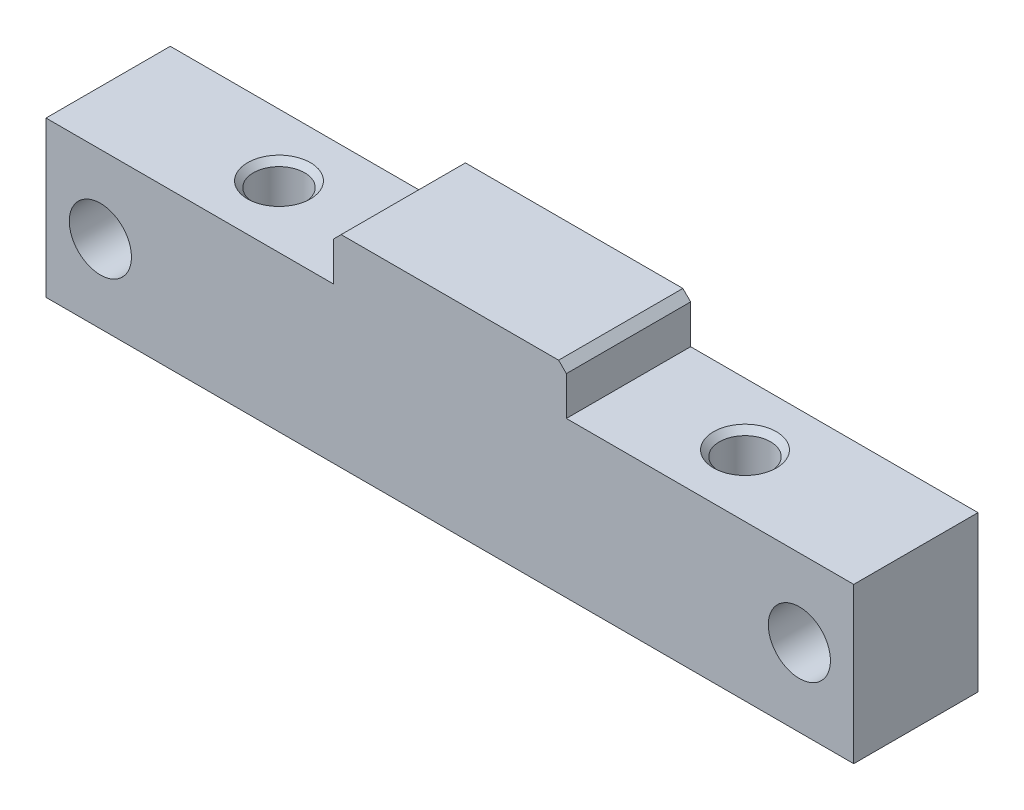
ISO-10303-21;
HEADER;
FILE_DESCRIPTION(('STEP AP214'),'2;1');
FILE_NAME('part.step','',(''),(''),'','','');
FILE_SCHEMA(('AUTOMOTIVE_DESIGN { 1 0 10303 214 1 1 1 1 }'));
ENDSEC;
DATA;
#1=APPLICATION_CONTEXT('core data for automotive mechanical design processes');
#2=APPLICATION_PROTOCOL_DEFINITION('international standard','automotive_design',2000,#1);
#3=PRODUCT_CONTEXT('',#1,'mechanical');
#4=PRODUCT('Part','Part','',(#3));
#5=PRODUCT_RELATED_PRODUCT_CATEGORY('part','',(#4));
#6=PRODUCT_DEFINITION_FORMATION('','',#4);
#7=PRODUCT_DEFINITION_CONTEXT('part definition',#1,'design');
#8=PRODUCT_DEFINITION('design','',#6,#7);
#9=PRODUCT_DEFINITION_SHAPE('','',#8);
#10=(LENGTH_UNIT() NAMED_UNIT(*) SI_UNIT(.MILLI.,.METRE.));
#11=(NAMED_UNIT(*) PLANE_ANGLE_UNIT() SI_UNIT($,.RADIAN.));
#12=(NAMED_UNIT(*) SI_UNIT($,.STERADIAN.) SOLID_ANGLE_UNIT());
#13=UNCERTAINTY_MEASURE_WITH_UNIT(LENGTH_MEASURE(1.E-05),#10,'distance_accuracy_value','');
#14=(GEOMETRIC_REPRESENTATION_CONTEXT(3) GLOBAL_UNCERTAINTY_ASSIGNED_CONTEXT((#13)) GLOBAL_UNIT_ASSIGNED_CONTEXT((#10,
#11,#12)) REPRESENTATION_CONTEXT('',''));
#15=CARTESIAN_POINT('',(0.,0.,0.));
#16=DIRECTION('',(0.,0.,1.));
#17=DIRECTION('',(1.,0.,0.));
#18=AXIS2_PLACEMENT_3D('',#15,#16,#17);
#19=CARTESIAN_POINT('',(7.5,13.,8.));
#20=DIRECTION('',(-1.,0.,0.));
#21=DIRECTION('',(0.,-1.,0.));
#22=AXIS2_PLACEMENT_3D('',#19,#20,#21);
#23=PLANE('',#22);
#24=DIRECTION('',(0.,1.,0.));
#25=VECTOR('',#24,1.);
#26=CARTESIAN_POINT('',(7.5,13.,0.));
#27=LINE('',#26,#25);
#28=CARTESIAN_POINT('',(7.5,10.,0.));
#29=VERTEX_POINT('',#28);
#30=CARTESIAN_POINT('',(7.5,12.5,0.));
#31=VERTEX_POINT('',#30);
#32=EDGE_CURVE('E161',#29,#31,#27,.T.);
#33=ORIENTED_EDGE('',*,*,#32,.T.);
#34=DIRECTION('',(0.,0.,1.));
#35=VECTOR('',#34,1.);
#36=CARTESIAN_POINT('',(7.5,12.5,8.));
#37=LINE('',#36,#35);
#38=CARTESIAN_POINT('',(7.5,12.5,8.));
#39=VERTEX_POINT('',#38);
#40=EDGE_CURVE('E72',#31,#39,#37,.T.);
#41=ORIENTED_EDGE('',*,*,#40,.T.);
#42=DIRECTION('',(0.,1.,0.));
#43=VECTOR('',#42,1.);
#44=CARTESIAN_POINT('',(7.5,13.,8.));
#45=LINE('',#44,#43);
#46=CARTESIAN_POINT('',(7.5,10.,8.));
#47=VERTEX_POINT('',#46);
#48=EDGE_CURVE('E178',#47,#39,#45,.T.);
#49=ORIENTED_EDGE('',*,*,#48,.F.);
#50=DIRECTION('',(0.,0.,-1.));
#51=VECTOR('',#50,1.);
#52=CARTESIAN_POINT('',(7.5,10.,8.));
#53=LINE('',#52,#51);
#54=EDGE_CURVE('E160',#47,#29,#53,.T.);
#55=ORIENTED_EDGE('',*,*,#54,.T.);
#56=EDGE_LOOP('',(#33,#41,#49,#55));
#57=FACE_BOUND('',#56,.T.);
#58=ADVANCED_FACE('F49',(#57),#23,.F.);
#59=CARTESIAN_POINT('',(-7.49999999999999,13.,8.));
#60=DIRECTION('',(0.,-1.,0.));
#61=DIRECTION('',(1.,0.,0.));
#62=AXIS2_PLACEMENT_3D('',#59,#60,#61);
#63=PLANE('',#62);
#64=DIRECTION('',(-1.,0.,0.));
#65=VECTOR('',#64,1.);
#66=CARTESIAN_POINT('',(-7.49999999999999,13.,8.));
#67=LINE('',#66,#65);
#68=CARTESIAN_POINT('',(7.,13.,8.));
#69=VERTEX_POINT('',#68);
#70=CARTESIAN_POINT('',(-6.99999999999999,13.,8.));
#71=VERTEX_POINT('',#70);
#72=EDGE_CURVE('E134',#69,#71,#67,.T.);
#73=ORIENTED_EDGE('',*,*,#72,.F.);
#74=DIRECTION('',(0.,0.,-1.));
#75=VECTOR('',#74,1.);
#76=CARTESIAN_POINT('',(7.,13.,8.));
#77=LINE('',#76,#75);
#78=CARTESIAN_POINT('',(7.,13.,0.));
#79=VERTEX_POINT('',#78);
#80=EDGE_CURVE('E192',#69,#79,#77,.T.);
#81=ORIENTED_EDGE('',*,*,#80,.T.);
#82=DIRECTION('',(-1.,0.,0.));
#83=VECTOR('',#82,1.);
#84=CARTESIAN_POINT('',(-7.49999999999999,13.,0.));
#85=LINE('',#84,#83);
#86=CARTESIAN_POINT('',(-6.99999999999999,13.,0.));
#87=VERTEX_POINT('',#86);
#88=EDGE_CURVE('E163',#79,#87,#85,.T.);
#89=ORIENTED_EDGE('',*,*,#88,.T.);
#90=DIRECTION('',(0.,0.,1.));
#91=VECTOR('',#90,1.);
#92=CARTESIAN_POINT('',(-6.99999999999999,13.,8.));
#93=LINE('',#92,#91);
#94=EDGE_CURVE('E143',#87,#71,#93,.T.);
#95=ORIENTED_EDGE('',*,*,#94,.T.);
#96=EDGE_LOOP('',(#73,#81,#89,#95));
#97=FACE_BOUND('',#96,.T.);
#98=ADVANCED_FACE('F205',(#97),#63,.F.);
#99=CARTESIAN_POINT('',(-7.49999999999999,13.,8.));
#100=DIRECTION('',(1.,0.,0.));
#101=DIRECTION('',(0.,1.,0.));
#102=AXIS2_PLACEMENT_3D('',#99,#100,#101);
#103=PLANE('',#102);
#104=DIRECTION('',(0.,-1.,0.));
#105=VECTOR('',#104,1.);
#106=CARTESIAN_POINT('',(-7.49999999999999,13.,8.));
#107=LINE('',#106,#105);
#108=CARTESIAN_POINT('',(-7.49999999999999,12.5,8.));
#109=VERTEX_POINT('',#108);
#110=CARTESIAN_POINT('',(-7.49999999999999,10.,8.));
#111=VERTEX_POINT('',#110);
#112=EDGE_CURVE('E126',#109,#111,#107,.T.);
#113=ORIENTED_EDGE('',*,*,#112,.F.);
#114=DIRECTION('',(0.,0.,-1.));
#115=VECTOR('',#114,1.);
#116=CARTESIAN_POINT('',(-7.49999999999999,12.5,8.));
#117=LINE('',#116,#115);
#118=CARTESIAN_POINT('',(-7.49999999999999,12.5,0.));
#119=VERTEX_POINT('',#118);
#120=EDGE_CURVE('E13',#109,#119,#117,.T.);
#121=ORIENTED_EDGE('',*,*,#120,.T.);
#122=DIRECTION('',(0.,-1.,0.));
#123=VECTOR('',#122,1.);
#124=CARTESIAN_POINT('',(-7.49999999999999,13.,0.));
#125=LINE('',#124,#123);
#126=CARTESIAN_POINT('',(-7.49999999999999,10.,0.));
#127=VERTEX_POINT('',#126);
#128=EDGE_CURVE('E140',#119,#127,#125,.T.);
#129=ORIENTED_EDGE('',*,*,#128,.T.);
#130=DIRECTION('',(0.,0.,-1.));
#131=VECTOR('',#130,1.);
#132=CARTESIAN_POINT('',(-7.49999999999999,10.,8.));
#133=LINE('',#132,#131);
#134=EDGE_CURVE('E137',#111,#127,#133,.T.);
#135=ORIENTED_EDGE('',*,*,#134,.F.);
#136=EDGE_LOOP('',(#113,#121,#129,#135));
#137=FACE_BOUND('',#136,.T.);
#138=ADVANCED_FACE('F138',(#137),#103,.F.);
#139=CARTESIAN_POINT('',(-7.49999999999999,10.,8.));
#140=DIRECTION('',(0.,-1.,0.));
#141=DIRECTION('',(1.,0.,0.));
#142=AXIS2_PLACEMENT_3D('',#139,#140,#141);
#143=PLANE('',#142);
#144=CARTESIAN_POINT('',(-15.,10.,4.));
#145=DIRECTION('',(0.,1.,0.));
#146=DIRECTION('',(0.,0.,1.));
#147=AXIS2_PLACEMENT_3D('',#144,#145,#146);
#148=CIRCLE('',#147,2.025);
#149=CARTESIAN_POINT('',(-15.,10.,6.025));
#150=VERTEX_POINT('',#149);
#151=EDGE_CURVE('E295',#150,#150,#148,.T.);
#152=ORIENTED_EDGE('',*,*,#151,.F.);
#153=EDGE_LOOP('',(#152));
#154=FACE_BOUND('',#153,.T.);
#155=DIRECTION('',(-1.,0.,0.));
#156=VECTOR('',#155,1.);
#157=CARTESIAN_POINT('',(-7.49999999999999,10.,0.));
#158=LINE('',#157,#156);
#159=CARTESIAN_POINT('',(-26.,9.99999999999999,0.));
#160=VERTEX_POINT('',#159);
#161=EDGE_CURVE('E168',#127,#160,#158,.T.);
#162=ORIENTED_EDGE('',*,*,#161,.T.);
#163=DIRECTION('',(0.,0.,-1.));
#164=VECTOR('',#163,1.);
#165=CARTESIAN_POINT('',(-26.,9.99999999999999,8.));
#166=LINE('',#165,#164);
#167=CARTESIAN_POINT('',(-26.,9.99999999999999,8.));
#168=VERTEX_POINT('',#167);
#169=EDGE_CURVE('E144',#168,#160,#166,.T.);
#170=ORIENTED_EDGE('',*,*,#169,.F.);
#171=DIRECTION('',(-1.,0.,0.));
#172=VECTOR('',#171,1.);
#173=CARTESIAN_POINT('',(-7.49999999999999,10.,8.));
#174=LINE('',#173,#172);
#175=EDGE_CURVE('E130',#111,#168,#174,.T.);
#176=ORIENTED_EDGE('',*,*,#175,.F.);
#177=ORIENTED_EDGE('',*,*,#134,.T.);
#178=EDGE_LOOP('',(#162,#170,#176,#177));
#179=FACE_BOUND('',#178,.T.);
#180=ADVANCED_FACE('F146',(#154,#179),#143,.F.);
#181=CARTESIAN_POINT('',(-26.,9.99999999999999,8.));
#182=DIRECTION('',(1.,0.,0.));
#183=DIRECTION('',(0.,1.,0.));
#184=AXIS2_PLACEMENT_3D('',#181,#182,#183);
#185=PLANE('',#184);
#186=DIRECTION('',(0.,-1.,0.));
#187=VECTOR('',#186,1.);
#188=CARTESIAN_POINT('',(-26.,9.99999999999999,0.));
#189=LINE('',#188,#187);
#190=CARTESIAN_POINT('',(-26.,0.,0.));
#191=VERTEX_POINT('',#190);
#192=EDGE_CURVE('E170',#160,#191,#189,.T.);
#193=ORIENTED_EDGE('',*,*,#192,.T.);
#194=DIRECTION('',(0.,0.,-1.));
#195=VECTOR('',#194,1.);
#196=CARTESIAN_POINT('',(-26.,0.,8.));
#197=LINE('',#196,#195);
#198=CARTESIAN_POINT('',(-26.,0.,8.));
#199=VERTEX_POINT('',#198);
#200=EDGE_CURVE('E187',#199,#191,#197,.T.);
#201=ORIENTED_EDGE('',*,*,#200,.F.);
#202=DIRECTION('',(0.,-1.,0.));
#203=VECTOR('',#202,1.);
#204=CARTESIAN_POINT('',(-26.,9.99999999999999,8.));
#205=LINE('',#204,#203);
#206=EDGE_CURVE('E149',#168,#199,#205,.T.);
#207=ORIENTED_EDGE('',*,*,#206,.F.);
#208=ORIENTED_EDGE('',*,*,#169,.T.);
#209=EDGE_LOOP('',(#193,#201,#207,#208));
#210=FACE_BOUND('',#209,.T.);
#211=ADVANCED_FACE('F230',(#210),#185,.F.);
#212=CARTESIAN_POINT('',(26.,0.,8.));
#213=DIRECTION('',(0.,1.,0.));
#214=DIRECTION('',(-1.,0.,0.));
#215=AXIS2_PLACEMENT_3D('',#212,#213,#214);
#216=PLANE('',#215);
#217=CARTESIAN_POINT('',(-15.,0.,4.));
#218=DIRECTION('',(0.,1.,0.));
#219=DIRECTION('',(0.,0.,1.));
#220=AXIS2_PLACEMENT_3D('',#217,#218,#219);
#221=CIRCLE('',#220,1.65);
#222=CARTESIAN_POINT('',(-15.,0.,5.65));
#223=VERTEX_POINT('',#222);
#224=EDGE_CURVE('E297',#223,#223,#221,.T.);
#225=ORIENTED_EDGE('',*,*,#224,.T.);
#226=EDGE_LOOP('',(#225));
#227=FACE_BOUND('',#226,.T.);
#228=CARTESIAN_POINT('',(15.,0.,4.));
#229=DIRECTION('',(0.,1.,0.));
#230=DIRECTION('',(0.,0.,1.));
#231=AXIS2_PLACEMENT_3D('',#228,#229,#230);
#232=CIRCLE('',#231,1.65);
#233=CARTESIAN_POINT('',(15.,0.,5.64999999999999));
#234=VERTEX_POINT('',#233);
#235=EDGE_CURVE('E308',#234,#234,#232,.T.);
#236=ORIENTED_EDGE('',*,*,#235,.T.);
#237=EDGE_LOOP('',(#236));
#238=FACE_BOUND('',#237,.T.);
#239=DIRECTION('',(1.,0.,0.));
#240=VECTOR('',#239,1.);
#241=CARTESIAN_POINT('',(26.,0.,0.));
#242=LINE('',#241,#240);
#243=CARTESIAN_POINT('',(26.,0.,0.));
#244=VERTEX_POINT('',#243);
#245=EDGE_CURVE('E172',#191,#244,#242,.T.);
#246=ORIENTED_EDGE('',*,*,#245,.T.);
#247=DIRECTION('',(0.,0.,-1.));
#248=VECTOR('',#247,1.);
#249=CARTESIAN_POINT('',(26.,0.,8.));
#250=LINE('',#249,#248);
#251=CARTESIAN_POINT('',(26.,0.,8.));
#252=VERTEX_POINT('',#251);
#253=EDGE_CURVE('E184',#252,#244,#250,.T.);
#254=ORIENTED_EDGE('',*,*,#253,.F.);
#255=DIRECTION('',(1.,0.,0.));
#256=VECTOR('',#255,1.);
#257=CARTESIAN_POINT('',(26.,0.,8.));
#258=LINE('',#257,#256);
#259=EDGE_CURVE('E151',#199,#252,#258,.T.);
#260=ORIENTED_EDGE('',*,*,#259,.F.);
#261=ORIENTED_EDGE('',*,*,#200,.T.);
#262=EDGE_LOOP('',(#246,#254,#260,#261));
#263=FACE_BOUND('',#262,.T.);
#264=ADVANCED_FACE('F227',(#227,#238,#263),#216,.F.);
#265=CARTESIAN_POINT('',(26.,10.,8.));
#266=DIRECTION('',(-1.,0.,0.));
#267=DIRECTION('',(0.,0.,1.));
#268=AXIS2_PLACEMENT_3D('',#265,#266,#267);
#269=PLANE('',#268);
#270=DIRECTION('',(0.,1.,0.));
#271=VECTOR('',#270,1.);
#272=CARTESIAN_POINT('',(26.,10.,0.));
#273=LINE('',#272,#271);
#274=CARTESIAN_POINT('',(26.,10.,0.));
#275=VERTEX_POINT('',#274);
#276=EDGE_CURVE('E174',#244,#275,#273,.T.);
#277=ORIENTED_EDGE('',*,*,#276,.T.);
#278=DIRECTION('',(0.,0.,-1.));
#279=VECTOR('',#278,1.);
#280=CARTESIAN_POINT('',(26.,10.,8.));
#281=LINE('',#280,#279);
#282=CARTESIAN_POINT('',(26.,10.,8.));
#283=VERTEX_POINT('',#282);
#284=EDGE_CURVE('E181',#283,#275,#281,.T.);
#285=ORIENTED_EDGE('',*,*,#284,.F.);
#286=DIRECTION('',(0.,1.,0.));
#287=VECTOR('',#286,1.);
#288=CARTESIAN_POINT('',(26.,10.,8.));
#289=LINE('',#288,#287);
#290=EDGE_CURVE('E156',#252,#283,#289,.T.);
#291=ORIENTED_EDGE('',*,*,#290,.F.);
#292=ORIENTED_EDGE('',*,*,#253,.T.);
#293=EDGE_LOOP('',(#277,#285,#291,#292));
#294=FACE_BOUND('',#293,.T.);
#295=ADVANCED_FACE('F222',(#294),#269,.F.);
#296=CARTESIAN_POINT('',(7.5,10.,8.));
#297=DIRECTION('',(0.,-1.,0.));
#298=DIRECTION('',(0.,0.,-1.));
#299=AXIS2_PLACEMENT_3D('',#296,#297,#298);
#300=PLANE('',#299);
#301=CARTESIAN_POINT('',(15.,10.,4.));
#302=DIRECTION('',(0.,1.,0.));
#303=DIRECTION('',(0.,0.,1.));
#304=AXIS2_PLACEMENT_3D('',#301,#302,#303);
#305=CIRCLE('',#304,2.025);
#306=CARTESIAN_POINT('',(15.,10.,6.025));
#307=VERTEX_POINT('',#306);
#308=EDGE_CURVE('E302',#307,#307,#305,.T.);
#309=ORIENTED_EDGE('',*,*,#308,.F.);
#310=EDGE_LOOP('',(#309));
#311=FACE_BOUND('',#310,.T.);
#312=DIRECTION('',(-1.,0.,0.));
#313=VECTOR('',#312,1.);
#314=CARTESIAN_POINT('',(7.5,10.,0.));
#315=LINE('',#314,#313);
#316=EDGE_CURVE('E176',#275,#29,#315,.T.);
#317=ORIENTED_EDGE('',*,*,#316,.T.);
#318=ORIENTED_EDGE('',*,*,#54,.F.);
#319=DIRECTION('',(-1.,0.,0.));
#320=VECTOR('',#319,1.);
#321=CARTESIAN_POINT('',(7.5,10.,8.));
#322=LINE('',#321,#320);
#323=EDGE_CURVE('E158',#283,#47,#322,.T.);
#324=ORIENTED_EDGE('',*,*,#323,.F.);
#325=ORIENTED_EDGE('',*,*,#284,.T.);
#326=EDGE_LOOP('',(#317,#318,#324,#325));
#327=FACE_BOUND('',#326,.T.);
#328=ADVANCED_FACE('F216',(#311,#327),#300,.F.);
#329=CARTESIAN_POINT('',(0.,0.,8.));
#330=DIRECTION('',(0.,0.,1.));
#331=DIRECTION('',(1.,0.,0.));
#332=AXIS2_PLACEMENT_3D('',#329,#330,#331);
#333=PLANE('',#332);
#334=CARTESIAN_POINT('',(-22.5,4.99999999999999,8.));
#335=DIRECTION('',(0.,0.,1.));
#336=DIRECTION('',(1.,0.,0.));
#337=AXIS2_PLACEMENT_3D('',#334,#335,#336);
#338=CIRCLE('',#337,2.);
#339=CARTESIAN_POINT('',(-20.5,4.99999999999999,8.));
#340=VERTEX_POINT('',#339);
#341=EDGE_CURVE('E314',#340,#340,#338,.T.);
#342=ORIENTED_EDGE('',*,*,#341,.F.);
#343=EDGE_LOOP('',(#342));
#344=FACE_BOUND('',#343,.T.);
#345=CARTESIAN_POINT('',(22.5,4.99999999999999,8.));
#346=DIRECTION('',(0.,0.,1.));
#347=DIRECTION('',(-1.,0.,0.));
#348=AXIS2_PLACEMENT_3D('',#345,#346,#347);
#349=CIRCLE('',#348,2.);
#350=CARTESIAN_POINT('',(20.5,4.99999999999999,8.));
#351=VERTEX_POINT('',#350);
#352=EDGE_CURVE('E311',#351,#351,#349,.T.);
#353=ORIENTED_EDGE('',*,*,#352,.F.);
#354=EDGE_LOOP('',(#353));
#355=FACE_BOUND('',#354,.T.);
#356=ORIENTED_EDGE('',*,*,#48,.T.);
#357=DIRECTION('',(0.707106781186548,-0.707106781186548,0.));
#358=VECTOR('',#357,1.);
#359=CARTESIAN_POINT('',(10.,10.,8.));
#360=LINE('',#359,#358);
#361=EDGE_CURVE('E57',#39,#69,#360,.F.);
#362=ORIENTED_EDGE('',*,*,#361,.T.);
#363=ORIENTED_EDGE('',*,*,#72,.T.);
#364=DIRECTION('',(0.707106781186552,0.707106781186543,0.));
#365=VECTOR('',#364,1.);
#366=CARTESIAN_POINT('',(-9.99999999999994,10.0000000000001,8.));
#367=LINE('',#366,#365);
#368=EDGE_CURVE('E64',#71,#109,#367,.F.);
#369=ORIENTED_EDGE('',*,*,#368,.T.);
#370=ORIENTED_EDGE('',*,*,#112,.T.);
#371=ORIENTED_EDGE('',*,*,#175,.T.);
#372=ORIENTED_EDGE('',*,*,#206,.T.);
#373=ORIENTED_EDGE('',*,*,#259,.T.);
#374=ORIENTED_EDGE('',*,*,#290,.T.);
#375=ORIENTED_EDGE('',*,*,#323,.T.);
#376=EDGE_LOOP('',(#356,#362,#363,#369,#370,#371,#372,#373,#374,#375));
#377=FACE_BOUND('',#376,.T.);
#378=ADVANCED_FACE('F128',(#344,#355,#377),#333,.T.);
#379=CARTESIAN_POINT('',(0.,0.,0.));
#380=DIRECTION('',(0.,0.,1.));
#381=DIRECTION('',(1.,0.,0.));
#382=AXIS2_PLACEMENT_3D('',#379,#380,#381);
#383=PLANE('',#382);
#384=CARTESIAN_POINT('',(-22.5,4.99999999999999,0.));
#385=DIRECTION('',(0.,0.,1.));
#386=DIRECTION('',(1.,0.,0.));
#387=AXIS2_PLACEMENT_3D('',#384,#385,#386);
#388=CIRCLE('',#387,2.);
#389=CARTESIAN_POINT('',(-20.5,4.99999999999999,0.));
#390=VERTEX_POINT('',#389);
#391=EDGE_CURVE('E164',#390,#390,#388,.T.);
#392=ORIENTED_EDGE('',*,*,#391,.T.);
#393=EDGE_LOOP('',(#392));
#394=FACE_BOUND('',#393,.T.);
#395=CARTESIAN_POINT('',(22.5,4.99999999999999,0.));
#396=DIRECTION('',(0.,0.,1.));
#397=DIRECTION('',(-1.,0.,0.));
#398=AXIS2_PLACEMENT_3D('',#395,#396,#397);
#399=CIRCLE('',#398,2.);
#400=CARTESIAN_POINT('',(20.5,4.99999999999999,0.));
#401=VERTEX_POINT('',#400);
#402=EDGE_CURVE('E317',#401,#401,#399,.T.);
#403=ORIENTED_EDGE('',*,*,#402,.T.);
#404=EDGE_LOOP('',(#403));
#405=FACE_BOUND('',#404,.T.);
#406=ORIENTED_EDGE('',*,*,#88,.F.);
#407=DIRECTION('',(-0.707106781186548,0.707106781186548,0.));
#408=VECTOR('',#407,1.);
#409=CARTESIAN_POINT('',(7.,13.,0.));
#410=LINE('',#409,#408);
#411=EDGE_CURVE('E197',#79,#31,#410,.F.);
#412=ORIENTED_EDGE('',*,*,#411,.T.);
#413=ORIENTED_EDGE('',*,*,#32,.F.);
#414=ORIENTED_EDGE('',*,*,#316,.F.);
#415=ORIENTED_EDGE('',*,*,#276,.F.);
#416=ORIENTED_EDGE('',*,*,#245,.F.);
#417=ORIENTED_EDGE('',*,*,#192,.F.);
#418=ORIENTED_EDGE('',*,*,#161,.F.);
#419=ORIENTED_EDGE('',*,*,#128,.F.);
#420=DIRECTION('',(-0.707106781186552,-0.707106781186543,0.));
#421=VECTOR('',#420,1.);
#422=CARTESIAN_POINT('',(-7.49999999999999,12.5,0.));
#423=LINE('',#422,#421);
#424=EDGE_CURVE('E195',#119,#87,#423,.F.);
#425=ORIENTED_EDGE('',*,*,#424,.T.);
#426=EDGE_LOOP('',(#406,#412,#413,#414,#415,#416,#417,#418,#419,#425));
#427=FACE_BOUND('',#426,.T.);
#428=ADVANCED_FACE('F211',(#394,#405,#427),#383,.F.);
#429=CARTESIAN_POINT('',(22.5,4.99999999999999,0.));
#430=DIRECTION('',(0.,0.,1.));
#431=DIRECTION('',(1.,0.,0.));
#432=AXIS2_PLACEMENT_3D('',#429,#430,#431);
#433=CYLINDRICAL_SURFACE('',#432,2.);
#434=ORIENTED_EDGE('',*,*,#402,.F.);
#435=EDGE_LOOP('',(#434));
#436=FACE_BOUND('',#435,.T.);
#437=ORIENTED_EDGE('',*,*,#352,.T.);
#438=EDGE_LOOP('',(#437));
#439=FACE_BOUND('',#438,.T.);
#440=ADVANCED_FACE('F261',(#436,#439),#433,.F.);
#441=CARTESIAN_POINT('',(-22.5,4.99999999999999,0.));
#442=DIRECTION('',(0.,0.,1.));
#443=DIRECTION('',(1.,0.,0.));
#444=AXIS2_PLACEMENT_3D('',#441,#442,#443);
#445=CYLINDRICAL_SURFACE('',#444,2.);
#446=ORIENTED_EDGE('',*,*,#391,.F.);
#447=EDGE_LOOP('',(#446));
#448=FACE_BOUND('',#447,.T.);
#449=ORIENTED_EDGE('',*,*,#341,.T.);
#450=EDGE_LOOP('',(#449));
#451=FACE_BOUND('',#450,.T.);
#452=ADVANCED_FACE('F268',(#448,#451),#445,.F.);
#453=CARTESIAN_POINT('',(15.,10.,4.));
#454=DIRECTION('',(0.,1.,0.));
#455=DIRECTION('',(0.,0.,1.));
#456=AXIS2_PLACEMENT_3D('',#453,#454,#455);
#457=CYLINDRICAL_SURFACE('',#456,1.65);
#458=ORIENTED_EDGE('',*,*,#235,.F.);
#459=EDGE_LOOP('',(#458));
#460=FACE_BOUND('',#459,.T.);
#461=CARTESIAN_POINT('',(15.,9.625,4.));
#462=DIRECTION('',(0.,1.,0.));
#463=DIRECTION('',(0.,0.,1.));
#464=AXIS2_PLACEMENT_3D('',#461,#462,#463);
#465=CIRCLE('',#464,1.65);
#466=CARTESIAN_POINT('',(15.,9.625,5.64999999999999));
#467=VERTEX_POINT('',#466);
#468=EDGE_CURVE('E305',#467,#467,#465,.T.);
#469=ORIENTED_EDGE('',*,*,#468,.T.);
#470=EDGE_LOOP('',(#469));
#471=FACE_BOUND('',#470,.T.);
#472=ADVANCED_FACE('F272',(#460,#471),#457,.F.);
#473=CARTESIAN_POINT('',(15.,10.,4.));
#474=DIRECTION('',(0.,1.,0.));
#475=DIRECTION('',(0.,0.,1.));
#476=AXIS2_PLACEMENT_3D('',#473,#474,#475);
#477=CONICAL_SURFACE('',#476,2.025,0.785398163397448);
#478=ORIENTED_EDGE('',*,*,#468,.F.);
#479=EDGE_LOOP('',(#478));
#480=FACE_BOUND('',#479,.T.);
#481=ORIENTED_EDGE('',*,*,#308,.T.);
#482=EDGE_LOOP('',(#481));
#483=FACE_BOUND('',#482,.T.);
#484=ADVANCED_FACE('F276',(#480,#483),#477,.F.);
#485=CARTESIAN_POINT('',(-15.,10.,4.));
#486=DIRECTION('',(0.,1.,0.));
#487=DIRECTION('',(0.,0.,1.));
#488=AXIS2_PLACEMENT_3D('',#485,#486,#487);
#489=CYLINDRICAL_SURFACE('',#488,1.65);
#490=ORIENTED_EDGE('',*,*,#224,.F.);
#491=EDGE_LOOP('',(#490));
#492=FACE_BOUND('',#491,.T.);
#493=CARTESIAN_POINT('',(-15.,9.62499999999999,4.));
#494=DIRECTION('',(0.,1.,0.));
#495=DIRECTION('',(0.,0.,1.));
#496=AXIS2_PLACEMENT_3D('',#493,#494,#495);
#497=CIRCLE('',#496,1.65);
#498=CARTESIAN_POINT('',(-15.,9.62499999999999,5.65));
#499=VERTEX_POINT('',#498);
#500=EDGE_CURVE('E292',#499,#499,#497,.T.);
#501=ORIENTED_EDGE('',*,*,#500,.T.);
#502=EDGE_LOOP('',(#501));
#503=FACE_BOUND('',#502,.T.);
#504=ADVANCED_FACE('F280',(#492,#503),#489,.F.);
#505=CARTESIAN_POINT('',(-15.,10.,4.));
#506=DIRECTION('',(0.,1.,0.));
#507=DIRECTION('',(0.,0.,1.));
#508=AXIS2_PLACEMENT_3D('',#505,#506,#507);
#509=CONICAL_SURFACE('',#508,2.025,0.785398163397444);
#510=ORIENTED_EDGE('',*,*,#500,.F.);
#511=EDGE_LOOP('',(#510));
#512=FACE_BOUND('',#511,.T.);
#513=ORIENTED_EDGE('',*,*,#151,.T.);
#514=EDGE_LOOP('',(#513));
#515=FACE_BOUND('',#514,.T.);
#516=ADVANCED_FACE('F236',(#512,#515),#509,.F.);
#517=CARTESIAN_POINT('',(7.,13.,8.));
#518=DIRECTION('',(-0.707106781186547,-0.707106781186547,0.));
#519=DIRECTION('',(0.,0.,-1.));
#520=AXIS2_PLACEMENT_3D('',#517,#518,#519);
#521=PLANE('',#520);
#522=ORIENTED_EDGE('',*,*,#361,.F.);
#523=ORIENTED_EDGE('',*,*,#40,.F.);
#524=ORIENTED_EDGE('',*,*,#411,.F.);
#525=ORIENTED_EDGE('',*,*,#80,.F.);
#526=EDGE_LOOP('',(#522,#523,#524,#525));
#527=FACE_BOUND('',#526,.T.);
#528=ADVANCED_FACE('F208',(#527),#521,.F.);
#529=CARTESIAN_POINT('',(-7.49999999999999,12.5,8.));
#530=DIRECTION('',(0.707106781186542,-0.707106781186552,0.));
#531=DIRECTION('',(0.,0.,-1.));
#532=AXIS2_PLACEMENT_3D('',#529,#530,#531);
#533=PLANE('',#532);
#534=ORIENTED_EDGE('',*,*,#368,.F.);
#535=ORIENTED_EDGE('',*,*,#94,.F.);
#536=ORIENTED_EDGE('',*,*,#424,.F.);
#537=ORIENTED_EDGE('',*,*,#120,.F.);
#538=EDGE_LOOP('',(#534,#535,#536,#537));
#539=FACE_BOUND('',#538,.T.);
#540=ADVANCED_FACE('F51',(#539),#533,.F.);
#541=CLOSED_SHELL('',(#58,#98,#138,#180,#211,#264,#295,#328,#378,#428,#440,#452,#472,#484,#504,
#516,#528,#540));
#542=MANIFOLD_SOLID_BREP('B2',#541);
#543=ADVANCED_BREP_SHAPE_REPRESENTATION('',(#18,#542),#14);
#544=SHAPE_DEFINITION_REPRESENTATION(#9,#543);
ENDSEC;
END-ISO-10303-21;
